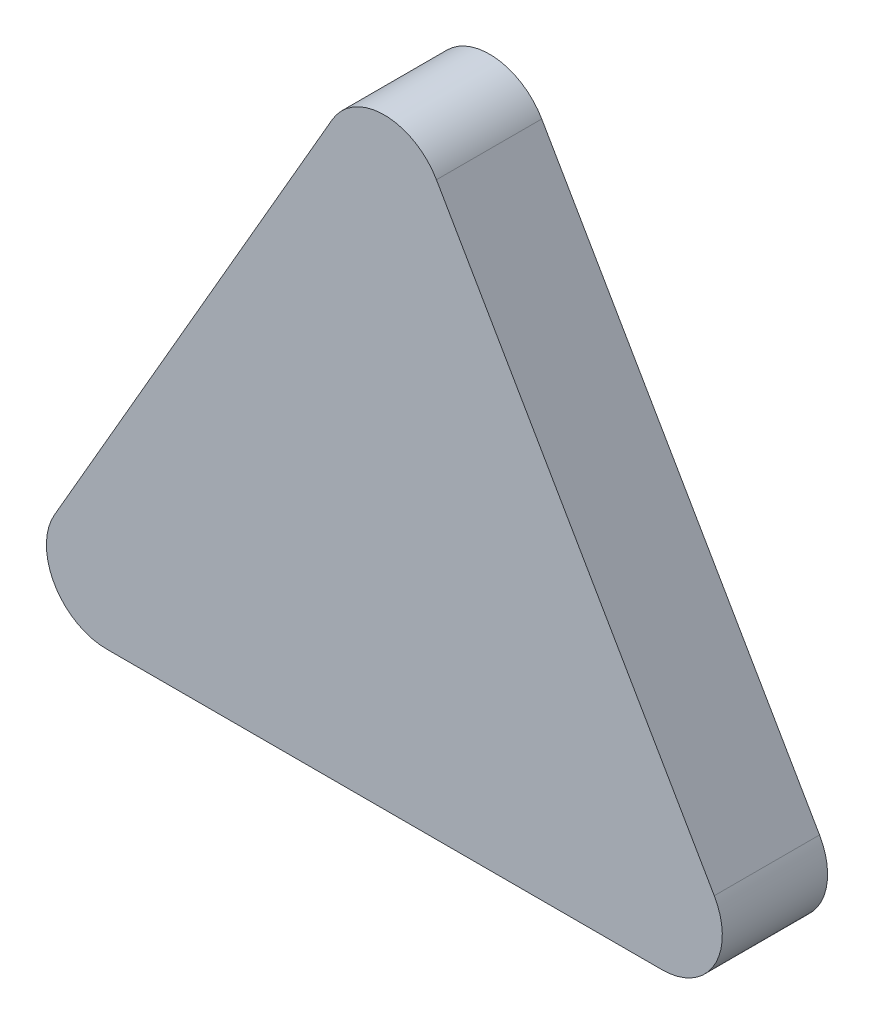
ISO-10303-21;
HEADER;
FILE_DESCRIPTION(('STEP AP214'),'2;1');
FILE_NAME('part.step','',(''),(''),'','','');
FILE_SCHEMA(('AUTOMOTIVE_DESIGN { 1 0 10303 214 1 1 1 1 }'));
ENDSEC;
DATA;
#1=APPLICATION_CONTEXT('core data for automotive mechanical design processes');
#2=APPLICATION_PROTOCOL_DEFINITION('international standard','automotive_design',2000,#1);
#3=PRODUCT_CONTEXT('',#1,'mechanical');
#4=PRODUCT('Part','Part','',(#3));
#5=PRODUCT_RELATED_PRODUCT_CATEGORY('part','',(#4));
#6=PRODUCT_DEFINITION_FORMATION('','',#4);
#7=PRODUCT_DEFINITION_CONTEXT('part definition',#1,'design');
#8=PRODUCT_DEFINITION('design','',#6,#7);
#9=PRODUCT_DEFINITION_SHAPE('','',#8);
#10=(LENGTH_UNIT() NAMED_UNIT(*) SI_UNIT(.MILLI.,.METRE.));
#11=(NAMED_UNIT(*) PLANE_ANGLE_UNIT() SI_UNIT($,.RADIAN.));
#12=(NAMED_UNIT(*) SI_UNIT($,.STERADIAN.) SOLID_ANGLE_UNIT());
#13=UNCERTAINTY_MEASURE_WITH_UNIT(LENGTH_MEASURE(1.E-05),#10,'distance_accuracy_value','');
#14=(GEOMETRIC_REPRESENTATION_CONTEXT(3) GLOBAL_UNCERTAINTY_ASSIGNED_CONTEXT((#13)) GLOBAL_UNIT_ASSIGNED_CONTEXT((#10,
#11,#12)) REPRESENTATION_CONTEXT('',''));
#15=CARTESIAN_POINT('',(0.,0.,0.));
#16=DIRECTION('',(0.,0.,1.));
#17=DIRECTION('',(1.,0.,0.));
#18=AXIS2_PLACEMENT_3D('',#15,#16,#17);
#19=CARTESIAN_POINT('',(0.,21.9970452561247,3.5));
#20=DIRECTION('',(0.866025403784439,-0.5,0.));
#21=DIRECTION('',(0.5,0.866025403784439,0.));
#22=AXIS2_PLACEMENT_3D('',#19,#20,#21);
#23=PLANE('',#22);
#24=DIRECTION('',(-0.5,-0.866025403784439,0.));
#25=VECTOR('',#24,1.);
#26=CARTESIAN_POINT('',(0.,21.9970452561247,0.));
#27=LINE('',#26,#25);
#28=CARTESIAN_POINT('',(-1.73205080756888,18.9970452561247,0.));
#29=VERTEX_POINT('',#28);
#30=CARTESIAN_POINT('',(-10.9679491924311,3.,0.));
#31=VERTEX_POINT('',#30);
#32=EDGE_CURVE('E115',#29,#31,#27,.T.);
#33=ORIENTED_EDGE('',*,*,#32,.T.);
#34=DIRECTION('',(0.,0.,-1.));
#35=VECTOR('',#34,1.);
#36=CARTESIAN_POINT('',(-10.9679491924311,3.,3.5));
#37=LINE('',#36,#35);
#38=CARTESIAN_POINT('',(-10.9679491924311,3.,3.5));
#39=VERTEX_POINT('',#38);
#40=EDGE_CURVE('E11',#31,#39,#37,.F.);
#41=ORIENTED_EDGE('',*,*,#40,.T.);
#42=DIRECTION('',(-0.5,-0.866025403784439,0.));
#43=VECTOR('',#42,1.);
#44=CARTESIAN_POINT('',(0.,21.9970452561247,3.5));
#45=LINE('',#44,#43);
#46=CARTESIAN_POINT('',(-1.73205080756888,18.9970452561247,3.5));
#47=VERTEX_POINT('',#46);
#48=EDGE_CURVE('E110',#47,#39,#45,.T.);
#49=ORIENTED_EDGE('',*,*,#48,.F.);
#50=DIRECTION('',(0.,0.,-1.));
#51=VECTOR('',#50,1.);
#52=CARTESIAN_POINT('',(-1.73205080756888,18.9970452561247,3.5));
#53=LINE('',#52,#51);
#54=EDGE_CURVE('E40',#47,#29,#53,.T.);
#55=ORIENTED_EDGE('',*,*,#54,.T.);
#56=EDGE_LOOP('',(#33,#41,#49,#55));
#57=FACE_BOUND('',#56,.T.);
#58=ADVANCED_FACE('F32',(#57),#23,.F.);
#59=CARTESIAN_POINT('',(-12.7,0.,3.5));
#60=DIRECTION('',(0.,1.,0.));
#61=DIRECTION('',(0.,0.,1.));
#62=AXIS2_PLACEMENT_3D('',#59,#60,#61);
#63=PLANE('',#62);
#64=DIRECTION('',(1.,0.,0.));
#65=VECTOR('',#64,1.);
#66=CARTESIAN_POINT('',(-12.7,0.,0.));
#67=LINE('',#66,#65);
#68=CARTESIAN_POINT('',(-9.23589838486224,0.,0.));
#69=VERTEX_POINT('',#68);
#70=CARTESIAN_POINT('',(9.23589838486225,0.,0.));
#71=VERTEX_POINT('',#70);
#72=EDGE_CURVE('E111',#69,#71,#67,.T.);
#73=ORIENTED_EDGE('',*,*,#72,.T.);
#74=DIRECTION('',(0.,0.,-1.));
#75=VECTOR('',#74,1.);
#76=CARTESIAN_POINT('',(9.23589838486225,0.,3.5));
#77=LINE('',#76,#75);
#78=CARTESIAN_POINT('',(9.23589838486225,0.,3.5));
#79=VERTEX_POINT('',#78);
#80=EDGE_CURVE('E90',#71,#79,#77,.F.);
#81=ORIENTED_EDGE('',*,*,#80,.T.);
#82=DIRECTION('',(1.,0.,0.));
#83=VECTOR('',#82,1.);
#84=CARTESIAN_POINT('',(-12.7,0.,3.5));
#85=LINE('',#84,#83);
#86=CARTESIAN_POINT('',(-9.23589838486224,0.,3.5));
#87=VERTEX_POINT('',#86);
#88=EDGE_CURVE('E113',#87,#79,#85,.T.);
#89=ORIENTED_EDGE('',*,*,#88,.F.);
#90=DIRECTION('',(0.,0.,-1.));
#91=VECTOR('',#90,1.);
#92=CARTESIAN_POINT('',(-9.23589838486224,0.,3.5));
#93=LINE('',#92,#91);
#94=EDGE_CURVE('E95',#87,#69,#93,.T.);
#95=ORIENTED_EDGE('',*,*,#94,.T.);
#96=EDGE_LOOP('',(#73,#81,#89,#95));
#97=FACE_BOUND('',#96,.T.);
#98=ADVANCED_FACE('F140',(#97),#63,.F.);
#99=CARTESIAN_POINT('',(12.7,0.,3.5));
#100=DIRECTION('',(-0.866025403784439,-0.5,0.));
#101=DIRECTION('',(0.5,-0.866025403784439,0.));
#102=AXIS2_PLACEMENT_3D('',#99,#100,#101);
#103=PLANE('',#102);
#104=DIRECTION('',(-0.5,0.866025403784439,0.));
#105=VECTOR('',#104,1.);
#106=CARTESIAN_POINT('',(12.7,0.,3.5));
#107=LINE('',#106,#105);
#108=CARTESIAN_POINT('',(10.9679491924311,3.,3.5));
#109=VERTEX_POINT('',#108);
#110=CARTESIAN_POINT('',(1.73205080756888,18.9970452561247,3.5));
#111=VERTEX_POINT('',#110);
#112=EDGE_CURVE('E104',#109,#111,#107,.T.);
#113=ORIENTED_EDGE('',*,*,#112,.F.);
#114=DIRECTION('',(0.,0.,-1.));
#115=VECTOR('',#114,1.);
#116=CARTESIAN_POINT('',(10.9679491924311,3.,3.5));
#117=LINE('',#116,#115);
#118=CARTESIAN_POINT('',(10.9679491924311,3.,0.));
#119=VERTEX_POINT('',#118);
#120=EDGE_CURVE('E89',#109,#119,#117,.T.);
#121=ORIENTED_EDGE('',*,*,#120,.T.);
#122=DIRECTION('',(-0.5,0.866025403784439,0.));
#123=VECTOR('',#122,1.);
#124=CARTESIAN_POINT('',(12.7,0.,0.));
#125=LINE('',#124,#123);
#126=CARTESIAN_POINT('',(1.73205080756888,18.9970452561247,0.));
#127=VERTEX_POINT('',#126);
#128=EDGE_CURVE('E102',#119,#127,#125,.T.);
#129=ORIENTED_EDGE('',*,*,#128,.T.);
#130=DIRECTION('',(0.,0.,-1.));
#131=VECTOR('',#130,1.);
#132=CARTESIAN_POINT('',(1.73205080756888,18.9970452561247,3.5));
#133=LINE('',#132,#131);
#134=EDGE_CURVE('E106',#127,#111,#133,.F.);
#135=ORIENTED_EDGE('',*,*,#134,.T.);
#136=EDGE_LOOP('',(#113,#121,#129,#135));
#137=FACE_BOUND('',#136,.T.);
#138=ADVANCED_FACE('F101',(#137),#103,.F.);
#139=CARTESIAN_POINT('',(0.,0.,3.5));
#140=DIRECTION('',(0.,0.,1.));
#141=DIRECTION('',(1.,0.,0.));
#142=AXIS2_PLACEMENT_3D('',#139,#140,#141);
#143=PLANE('',#142);
#144=ORIENTED_EDGE('',*,*,#88,.T.);
#145=CARTESIAN_POINT('',(9.23589838486225,2.,3.5));
#146=DIRECTION('',(0.,0.,1.));
#147=DIRECTION('',(1.,0.,0.));
#148=AXIS2_PLACEMENT_3D('',#145,#146,#147);
#149=CIRCLE('',#148,2.);
#150=EDGE_CURVE('E128',#79,#109,#149,.T.);
#151=ORIENTED_EDGE('',*,*,#150,.T.);
#152=ORIENTED_EDGE('',*,*,#112,.T.);
#153=CARTESIAN_POINT('',(0.,17.9970452561247,3.5));
#154=DIRECTION('',(0.,0.,1.));
#155=DIRECTION('',(1.,0.,0.));
#156=AXIS2_PLACEMENT_3D('',#153,#154,#155);
#157=CIRCLE('',#156,2.);
#158=EDGE_CURVE('E52',#111,#47,#157,.T.);
#159=ORIENTED_EDGE('',*,*,#158,.T.);
#160=ORIENTED_EDGE('',*,*,#48,.T.);
#161=CARTESIAN_POINT('',(-9.23589838486224,2.,3.5));
#162=DIRECTION('',(0.,0.,1.));
#163=DIRECTION('',(1.,0.,0.));
#164=AXIS2_PLACEMENT_3D('',#161,#162,#163);
#165=CIRCLE('',#164,2.);
#166=EDGE_CURVE('E126',#39,#87,#165,.T.);
#167=ORIENTED_EDGE('',*,*,#166,.T.);
#168=EDGE_LOOP('',(#144,#151,#152,#159,#160,#167));
#169=FACE_BOUND('',#168,.T.);
#170=ADVANCED_FACE('F136',(#169),#143,.T.);
#171=CARTESIAN_POINT('',(0.,0.,0.));
#172=DIRECTION('',(0.,0.,1.));
#173=DIRECTION('',(1.,0.,0.));
#174=AXIS2_PLACEMENT_3D('',#171,#172,#173);
#175=PLANE('',#174);
#176=ORIENTED_EDGE('',*,*,#128,.F.);
#177=CARTESIAN_POINT('',(9.23589838486225,2.,0.));
#178=DIRECTION('',(0.,0.,1.));
#179=DIRECTION('',(1.,0.,0.));
#180=AXIS2_PLACEMENT_3D('',#177,#178,#179);
#181=CIRCLE('',#180,2.);
#182=EDGE_CURVE('E85',#119,#71,#181,.F.);
#183=ORIENTED_EDGE('',*,*,#182,.T.);
#184=ORIENTED_EDGE('',*,*,#72,.F.);
#185=CARTESIAN_POINT('',(-9.23589838486224,2.,0.));
#186=DIRECTION('',(0.,0.,1.));
#187=DIRECTION('',(1.,0.,0.));
#188=AXIS2_PLACEMENT_3D('',#185,#186,#187);
#189=CIRCLE('',#188,2.);
#190=EDGE_CURVE('E96',#69,#31,#189,.F.);
#191=ORIENTED_EDGE('',*,*,#190,.T.);
#192=ORIENTED_EDGE('',*,*,#32,.F.);
#193=CARTESIAN_POINT('',(0.,17.9970452561247,0.));
#194=DIRECTION('',(0.,0.,1.));
#195=DIRECTION('',(1.,0.,0.));
#196=AXIS2_PLACEMENT_3D('',#193,#194,#195);
#197=CIRCLE('',#196,2.);
#198=EDGE_CURVE('E105',#29,#127,#197,.F.);
#199=ORIENTED_EDGE('',*,*,#198,.T.);
#200=EDGE_LOOP('',(#176,#183,#184,#191,#192,#199));
#201=FACE_BOUND('',#200,.T.);
#202=ADVANCED_FACE('F108',(#201),#175,.F.);
#203=CARTESIAN_POINT('',(9.23589838486225,2.,3.5));
#204=DIRECTION('',(0.,0.,-1.));
#205=DIRECTION('',(-1.,0.,0.));
#206=AXIS2_PLACEMENT_3D('',#203,#204,#205);
#207=CYLINDRICAL_SURFACE('',#206,2.);
#208=ORIENTED_EDGE('',*,*,#150,.F.);
#209=ORIENTED_EDGE('',*,*,#80,.F.);
#210=ORIENTED_EDGE('',*,*,#182,.F.);
#211=ORIENTED_EDGE('',*,*,#120,.F.);
#212=EDGE_LOOP('',(#208,#209,#210,#211));
#213=FACE_BOUND('',#212,.T.);
#214=ADVANCED_FACE('F88',(#213),#207,.T.);
#215=CARTESIAN_POINT('',(-9.23589838486224,2.,3.5));
#216=DIRECTION('',(0.,0.,-1.));
#217=DIRECTION('',(-1.,0.,0.));
#218=AXIS2_PLACEMENT_3D('',#215,#216,#217);
#219=CYLINDRICAL_SURFACE('',#218,2.);
#220=ORIENTED_EDGE('',*,*,#166,.F.);
#221=ORIENTED_EDGE('',*,*,#40,.F.);
#222=ORIENTED_EDGE('',*,*,#190,.F.);
#223=ORIENTED_EDGE('',*,*,#94,.F.);
#224=EDGE_LOOP('',(#220,#221,#222,#223));
#225=FACE_BOUND('',#224,.T.);
#226=ADVANCED_FACE('F142',(#225),#219,.T.);
#227=CARTESIAN_POINT('',(0.,17.9970452561247,3.5));
#228=DIRECTION('',(0.,0.,-1.));
#229=DIRECTION('',(-1.,0.,0.));
#230=AXIS2_PLACEMENT_3D('',#227,#228,#229);
#231=CYLINDRICAL_SURFACE('',#230,2.);
#232=ORIENTED_EDGE('',*,*,#158,.F.);
#233=ORIENTED_EDGE('',*,*,#134,.F.);
#234=ORIENTED_EDGE('',*,*,#198,.F.);
#235=ORIENTED_EDGE('',*,*,#54,.F.);
#236=EDGE_LOOP('',(#232,#233,#234,#235));
#237=FACE_BOUND('',#236,.T.);
#238=ADVANCED_FACE('F34',(#237),#231,.T.);
#239=CLOSED_SHELL('',(#58,#98,#138,#170,#202,#214,#226,#238));
#240=MANIFOLD_SOLID_BREP('B2',#239);
#241=ADVANCED_BREP_SHAPE_REPRESENTATION('',(#18,#240),#14);
#242=SHAPE_DEFINITION_REPRESENTATION(#9,#241);
ENDSEC;
END-ISO-10303-21;
